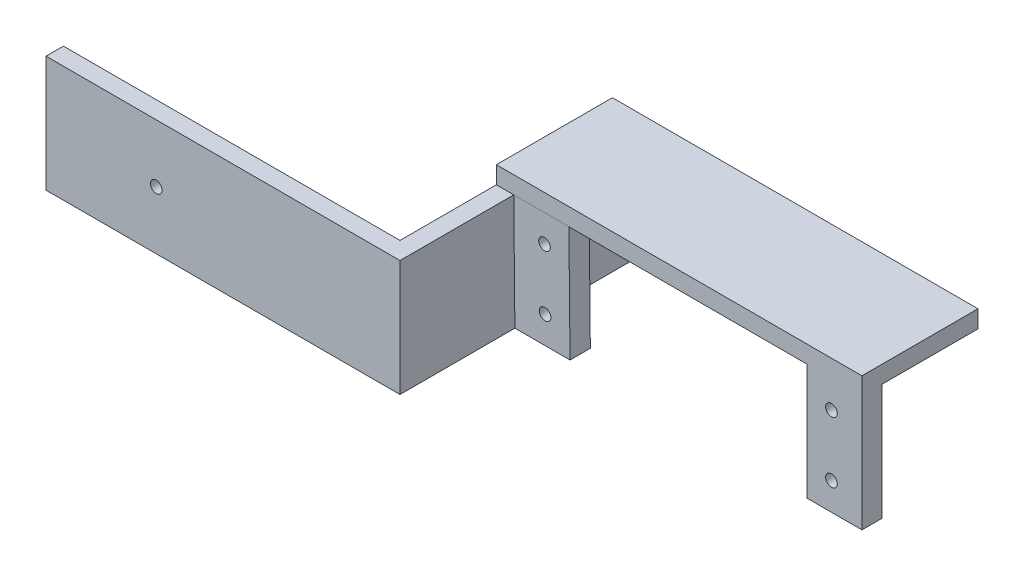
ISO-10303-21;
HEADER;
FILE_DESCRIPTION(('STEP AP214'),'2;1');
FILE_NAME('part.step','',(''),(''),'','','');
FILE_SCHEMA(('AUTOMOTIVE_DESIGN { 1 0 10303 214 1 1 1 1 }'));
ENDSEC;
DATA;
#1=APPLICATION_CONTEXT('core data for automotive mechanical design processes');
#2=APPLICATION_PROTOCOL_DEFINITION('international standard','automotive_design',2000,#1);
#3=PRODUCT_CONTEXT('',#1,'mechanical');
#4=PRODUCT('Part','Part','',(#3));
#5=PRODUCT_RELATED_PRODUCT_CATEGORY('part','',(#4));
#6=PRODUCT_DEFINITION_FORMATION('','',#4);
#7=PRODUCT_DEFINITION_CONTEXT('part definition',#1,'design');
#8=PRODUCT_DEFINITION('design','',#6,#7);
#9=PRODUCT_DEFINITION_SHAPE('','',#8);
#10=(LENGTH_UNIT() NAMED_UNIT(*) SI_UNIT(.MILLI.,.METRE.));
#11=(NAMED_UNIT(*) PLANE_ANGLE_UNIT() SI_UNIT($,.RADIAN.));
#12=(NAMED_UNIT(*) SI_UNIT($,.STERADIAN.) SOLID_ANGLE_UNIT());
#13=UNCERTAINTY_MEASURE_WITH_UNIT(LENGTH_MEASURE(1.E-05),#10,'distance_accuracy_value','');
#14=(GEOMETRIC_REPRESENTATION_CONTEXT(3) GLOBAL_UNCERTAINTY_ASSIGNED_CONTEXT((#13)) GLOBAL_UNIT_ASSIGNED_CONTEXT((#10,
#11,#12)) REPRESENTATION_CONTEXT('',''));
#15=CARTESIAN_POINT('',(0.,0.,0.));
#16=DIRECTION('',(0.,0.,1.));
#17=DIRECTION('',(1.,0.,0.));
#18=AXIS2_PLACEMENT_3D('',#15,#16,#17);
#19=CARTESIAN_POINT('',(57.4713641488162,20.,9.21573145148629));
#20=DIRECTION('',(0.,1.,0.));
#21=DIRECTION('',(0.,0.,1.));
#22=AXIS2_PLACEMENT_3D('',#19,#20,#21);
#23=PLANE('',#22);
#24=DIRECTION('',(0.,0.,-1.));
#25=VECTOR('',#24,1.);
#26=CARTESIAN_POINT('',(47.9713641488162,20.,5.71573145148629));
#27=LINE('',#26,#25);
#28=CARTESIAN_POINT('',(47.9713641488162,20.,9.21573145148629));
#29=VERTEX_POINT('',#28);
#30=CARTESIAN_POINT('',(47.9713641488162,20.,5.71573145148629));
#31=VERTEX_POINT('',#30);
#32=EDGE_CURVE('E303',#29,#31,#27,.T.);
#33=ORIENTED_EDGE('',*,*,#32,.F.);
#34=DIRECTION('',(-1.,0.,0.));
#35=VECTOR('',#34,1.);
#36=CARTESIAN_POINT('',(57.4713641488162,20.,9.21573145148629));
#37=LINE('',#36,#35);
#38=CARTESIAN_POINT('',(6.97136414881624,20.,9.21573145148629));
#39=VERTEX_POINT('',#38);
#40=EDGE_CURVE('E174',#29,#39,#37,.T.);
#41=ORIENTED_EDGE('',*,*,#40,.T.);
#42=DIRECTION('',(0.,0.,1.));
#43=VECTOR('',#42,1.);
#44=CARTESIAN_POINT('',(6.97136414881624,20.,5.71573145148628));
#45=LINE('',#44,#43);
#46=CARTESIAN_POINT('',(6.97136414881624,20.,5.71573145148628));
#47=VERTEX_POINT('',#46);
#48=EDGE_CURVE('E182',#47,#39,#45,.T.);
#49=ORIENTED_EDGE('',*,*,#48,.F.);
#50=DIRECTION('',(-1.,0.,0.));
#51=VECTOR('',#50,1.);
#52=CARTESIAN_POINT('',(6.97136414881624,20.,5.71573145148628));
#53=LINE('',#52,#51);
#54=CARTESIAN_POINT('',(-2.52863585118376,20.,5.71573145148628));
#55=VERTEX_POINT('',#54);
#56=EDGE_CURVE('E58',#47,#55,#53,.T.);
#57=ORIENTED_EDGE('',*,*,#56,.T.);
#58=DIRECTION('',(0.,0.,-1.));
#59=VECTOR('',#58,1.);
#60=CARTESIAN_POINT('',(-2.52863585118376,20.,9.21573145148629));
#61=LINE('',#60,#59);
#62=CARTESIAN_POINT('',(-2.52863585118376,20.,-10.7842685485137));
#63=VERTEX_POINT('',#62);
#64=EDGE_CURVE('E200',#55,#63,#61,.T.);
#65=ORIENTED_EDGE('',*,*,#64,.T.);
#66=DIRECTION('',(-1.,0.,0.));
#67=VECTOR('',#66,1.);
#68=CARTESIAN_POINT('',(57.4713641488162,20.,-10.7842685485137));
#69=LINE('',#68,#67);
#70=CARTESIAN_POINT('',(57.4713641488162,20.,-10.7842685485137));
#71=VERTEX_POINT('',#70);
#72=EDGE_CURVE('E211',#71,#63,#69,.T.);
#73=ORIENTED_EDGE('',*,*,#72,.F.);
#74=DIRECTION('',(0.,0.,-1.));
#75=VECTOR('',#74,1.);
#76=CARTESIAN_POINT('',(57.4713641488162,20.,9.21573145148629));
#77=LINE('',#76,#75);
#78=CARTESIAN_POINT('',(57.4713641488162,20.,5.71573145148629));
#79=VERTEX_POINT('',#78);
#80=EDGE_CURVE('E203',#79,#71,#77,.T.);
#81=ORIENTED_EDGE('',*,*,#80,.F.);
#82=DIRECTION('',(1.,0.,0.));
#83=VECTOR('',#82,1.);
#84=CARTESIAN_POINT('',(57.4713641488162,20.,5.71573145148629));
#85=LINE('',#84,#83);
#86=EDGE_CURVE('E168',#31,#79,#85,.T.);
#87=ORIENTED_EDGE('',*,*,#86,.F.);
#88=EDGE_LOOP('',(#33,#41,#49,#57,#65,#73,#81,#87));
#89=FACE_BOUND('',#88,.T.);
#90=ADVANCED_FACE('F33',(#89),#23,.F.);
#91=CARTESIAN_POINT('',(-2.52863585118376,20.,28.8157314514863));
#92=DIRECTION('',(-1.,0.,0.));
#93=DIRECTION('',(0.,0.,1.));
#94=AXIS2_PLACEMENT_3D('',#91,#92,#93);
#95=PLANE('',#94);
#96=DIRECTION('',(0.,-0.999950003749688,-0.00999950003749664));
#97=VECTOR('',#96,1.);
#98=CARTESIAN_POINT('',(-2.52863585118376,20.,9.21573145148629));
#99=LINE('',#98,#97);
#100=CARTESIAN_POINT('',(-2.52863585118376,20.,9.21573145148629));
#101=VERTEX_POINT('',#100);
#102=CARTESIAN_POINT('',(-2.52863585118376,0.,9.0157314514863));
#103=VERTEX_POINT('',#102);
#104=EDGE_CURVE('E175',#101,#103,#99,.T.);
#105=ORIENTED_EDGE('',*,*,#104,.F.);
#106=DIRECTION('',(0.,0.,-1.));
#107=VECTOR('',#106,1.);
#108=CARTESIAN_POINT('',(-2.52863585118376,20.,28.8157314514863));
#109=LINE('',#108,#107);
#110=CARTESIAN_POINT('',(-2.52863585118376,20.,28.8157314514863));
#111=VERTEX_POINT('',#110);
#112=EDGE_CURVE('E235',#111,#101,#109,.T.);
#113=ORIENTED_EDGE('',*,*,#112,.F.);
#114=DIRECTION('',(0.,-1.,0.));
#115=VECTOR('',#114,1.);
#116=CARTESIAN_POINT('',(-2.52863585118376,20.,28.8157314514863));
#117=LINE('',#116,#115);
#118=CARTESIAN_POINT('',(-2.52863585118376,0.,28.8157314514863));
#119=VERTEX_POINT('',#118);
#120=EDGE_CURVE('E42',#111,#119,#117,.T.);
#121=ORIENTED_EDGE('',*,*,#120,.T.);
#122=DIRECTION('',(0.,0.,-1.));
#123=VECTOR('',#122,1.);
#124=CARTESIAN_POINT('',(-2.52863585118376,0.,28.8157314514863));
#125=LINE('',#124,#123);
#126=EDGE_CURVE('E248',#119,#103,#125,.T.);
#127=ORIENTED_EDGE('',*,*,#126,.T.);
#128=EDGE_LOOP('',(#105,#113,#121,#127));
#129=FACE_BOUND('',#128,.T.);
#130=ADVANCED_FACE('F336',(#129),#95,.F.);
#131=DIRECTION('',(0.,0.999950003749688,0.00999950003749664));
#132=VECTOR('',#131,1.);
#133=CARTESIAN_POINT('',(-2.52863585118376,0.,5.51573145148629));
#134=LINE('',#133,#132);
#135=CARTESIAN_POINT('',(-2.52863585118376,0.,5.51573145148629));
#136=VERTEX_POINT('',#135);
#137=EDGE_CURVE('E177',#136,#55,#134,.T.);
#138=ORIENTED_EDGE('',*,*,#137,.F.);
#139=CARTESIAN_POINT('',(-2.52863585118376,0.,-10.7842685485137));
#140=VERTEX_POINT('',#139);
#141=EDGE_CURVE('E247',#136,#140,#125,.T.);
#142=ORIENTED_EDGE('',*,*,#141,.T.);
#143=DIRECTION('',(0.,-1.,0.));
#144=VECTOR('',#143,1.);
#145=CARTESIAN_POINT('',(-2.52863585118376,20.,-10.7842685485137));
#146=LINE('',#145,#144);
#147=EDGE_CURVE('E264',#63,#140,#146,.T.);
#148=ORIENTED_EDGE('',*,*,#147,.F.);
#149=ORIENTED_EDGE('',*,*,#64,.F.);
#150=EDGE_LOOP('',(#138,#142,#148,#149));
#151=FACE_BOUND('',#150,.T.);
#152=ADVANCED_FACE('F355',(#151),#95,.F.);
#153=CARTESIAN_POINT('',(0.,20.,0.));
#154=DIRECTION('',(0.,-1.,0.));
#155=DIRECTION('',(0.,0.,-1.));
#156=AXIS2_PLACEMENT_3D('',#153,#154,#155);
#157=PLANE('',#156);
#158=DIRECTION('',(1.,0.,0.));
#159=VECTOR('',#158,1.);
#160=CARTESIAN_POINT('',(-5.52863585118376,20.,9.21573145148629));
#161=LINE('',#160,#159);
#162=CARTESIAN_POINT('',(-5.52863585118376,20.,9.21573145148629));
#163=VERTEX_POINT('',#162);
#164=EDGE_CURVE('E216',#163,#101,#161,.T.);
#165=ORIENTED_EDGE('',*,*,#164,.F.);
#166=DIRECTION('',(0.,0.,1.));
#167=VECTOR('',#166,1.);
#168=CARTESIAN_POINT('',(-5.52863585118376,20.,-10.7842685485137));
#169=LINE('',#168,#167);
#170=CARTESIAN_POINT('',(-5.52863585118376,20.,25.8157314514863));
#171=VERTEX_POINT('',#170);
#172=EDGE_CURVE('E238',#163,#171,#169,.T.);
#173=ORIENTED_EDGE('',*,*,#172,.T.);
#174=DIRECTION('',(-1.,0.,0.));
#175=VECTOR('',#174,1.);
#176=CARTESIAN_POINT('',(-63.5286358511838,20.,25.8157314514863));
#177=LINE('',#176,#175);
#178=CARTESIAN_POINT('',(-63.5286358511838,20.,25.8157314514863));
#179=VERTEX_POINT('',#178);
#180=EDGE_CURVE('E240',#171,#179,#177,.T.);
#181=ORIENTED_EDGE('',*,*,#180,.T.);
#182=DIRECTION('',(0.,0.,1.));
#183=VECTOR('',#182,1.);
#184=CARTESIAN_POINT('',(-63.5286358511838,20.,28.8157314514863));
#185=LINE('',#184,#183);
#186=CARTESIAN_POINT('',(-63.5286358511838,20.,28.8157314514863));
#187=VERTEX_POINT('',#186);
#188=EDGE_CURVE('E229',#179,#187,#185,.T.);
#189=ORIENTED_EDGE('',*,*,#188,.T.);
#190=DIRECTION('',(1.,0.,0.));
#191=VECTOR('',#190,1.);
#192=CARTESIAN_POINT('',(-63.5286358511838,20.,28.8157314514863));
#193=LINE('',#192,#191);
#194=EDGE_CURVE('E232',#187,#111,#193,.T.);
#195=ORIENTED_EDGE('',*,*,#194,.T.);
#196=ORIENTED_EDGE('',*,*,#112,.T.);
#197=EDGE_LOOP('',(#165,#173,#181,#189,#195,#196));
#198=FACE_BOUND('',#197,.T.);
#199=ADVANCED_FACE('F330',(#198),#157,.F.);
#200=CARTESIAN_POINT('',(-63.5286358511838,20.,28.8157314514863));
#201=DIRECTION('',(1.,0.,0.));
#202=DIRECTION('',(0.,0.,-1.));
#203=AXIS2_PLACEMENT_3D('',#200,#201,#202);
#204=PLANE('',#203);
#205=DIRECTION('',(0.,0.,1.));
#206=VECTOR('',#205,1.);
#207=CARTESIAN_POINT('',(-63.5286358511838,0.,28.8157314514863));
#208=LINE('',#207,#206);
#209=CARTESIAN_POINT('',(-63.5286358511838,0.,25.8157314514863));
#210=VERTEX_POINT('',#209);
#211=CARTESIAN_POINT('',(-63.5286358511838,0.,28.8157314514863));
#212=VERTEX_POINT('',#211);
#213=EDGE_CURVE('E228',#210,#212,#208,.T.);
#214=ORIENTED_EDGE('',*,*,#213,.T.);
#215=DIRECTION('',(0.,-1.,0.));
#216=VECTOR('',#215,1.);
#217=CARTESIAN_POINT('',(-63.5286358511838,20.,28.8157314514863));
#218=LINE('',#217,#216);
#219=EDGE_CURVE('E11',#187,#212,#218,.T.);
#220=ORIENTED_EDGE('',*,*,#219,.F.);
#221=ORIENTED_EDGE('',*,*,#188,.F.);
#222=DIRECTION('',(0.,-1.,0.));
#223=VECTOR('',#222,1.);
#224=CARTESIAN_POINT('',(-63.5286358511838,20.,25.8157314514863));
#225=LINE('',#224,#223);
#226=EDGE_CURVE('E242',#179,#210,#225,.T.);
#227=ORIENTED_EDGE('',*,*,#226,.T.);
#228=EDGE_LOOP('',(#214,#220,#221,#227));
#229=FACE_BOUND('',#228,.T.);
#230=ADVANCED_FACE('F35',(#229),#204,.F.);
#231=CARTESIAN_POINT('',(-63.5286358511838,20.,28.8157314514863));
#232=DIRECTION('',(0.,0.,-1.));
#233=DIRECTION('',(-1.,0.,0.));
#234=AXIS2_PLACEMENT_3D('',#231,#232,#233);
#235=PLANE('',#234);
#236=CARTESIAN_POINT('',(-44.5286358511838,10.,28.8157314514863));
#237=DIRECTION('',(0.,0.,-1.));
#238=DIRECTION('',(-1.,0.,0.));
#239=AXIS2_PLACEMENT_3D('',#236,#237,#238);
#240=CIRCLE('',#239,0.999999999999998);
#241=CARTESIAN_POINT('',(-45.5286358511838,10.,28.8157314514863));
#242=VERTEX_POINT('',#241);
#243=EDGE_CURVE('E294',#242,#242,#240,.T.);
#244=ORIENTED_EDGE('',*,*,#243,.T.);
#245=EDGE_LOOP('',(#244));
#246=FACE_BOUND('',#245,.T.);
#247=DIRECTION('',(1.,0.,0.));
#248=VECTOR('',#247,1.);
#249=CARTESIAN_POINT('',(-63.5286358511838,0.,28.8157314514863));
#250=LINE('',#249,#248);
#251=EDGE_CURVE('E245',#212,#119,#250,.T.);
#252=ORIENTED_EDGE('',*,*,#251,.T.);
#253=ORIENTED_EDGE('',*,*,#120,.F.);
#254=ORIENTED_EDGE('',*,*,#194,.F.);
#255=ORIENTED_EDGE('',*,*,#219,.T.);
#256=EDGE_LOOP('',(#252,#253,#254,#255));
#257=FACE_BOUND('',#256,.T.);
#258=ADVANCED_FACE('F359',(#246,#257),#235,.F.);
#259=CARTESIAN_POINT('',(-2.52863585118376,20.,-10.7842685485137));
#260=DIRECTION('',(0.,0.,1.));
#261=DIRECTION('',(1.,0.,0.));
#262=AXIS2_PLACEMENT_3D('',#259,#260,#261);
#263=PLANE('',#262);
#264=DIRECTION('',(-1.,0.,0.));
#265=VECTOR('',#264,1.);
#266=CARTESIAN_POINT('',(-2.52863585118376,0.,-10.7842685485137));
#267=LINE('',#266,#265);
#268=CARTESIAN_POINT('',(-5.52863585118376,0.,-10.7842685485137));
#269=VERTEX_POINT('',#268);
#270=EDGE_CURVE('E251',#140,#269,#267,.T.);
#271=ORIENTED_EDGE('',*,*,#270,.T.);
#272=DIRECTION('',(0.,-1.,0.));
#273=VECTOR('',#272,1.);
#274=CARTESIAN_POINT('',(-5.52863585118376,20.,-10.7842685485137));
#275=LINE('',#274,#273);
#276=CARTESIAN_POINT('',(-5.52863585118376,23.,-10.7842685485137));
#277=VERTEX_POINT('',#276);
#278=EDGE_CURVE('E261',#277,#269,#275,.T.);
#279=ORIENTED_EDGE('',*,*,#278,.F.);
#280=DIRECTION('',(-1.,0.,0.));
#281=VECTOR('',#280,1.);
#282=CARTESIAN_POINT('',(-2.52863585118376,23.,-10.7842685485137));
#283=LINE('',#282,#281);
#284=CARTESIAN_POINT('',(57.4713641488162,23.,-10.7842685485137));
#285=VERTEX_POINT('',#284);
#286=EDGE_CURVE('E217',#285,#277,#283,.T.);
#287=ORIENTED_EDGE('',*,*,#286,.F.);
#288=DIRECTION('',(0.,1.,0.));
#289=VECTOR('',#288,1.);
#290=CARTESIAN_POINT('',(57.4713641488162,20.,-10.7842685485137));
#291=LINE('',#290,#289);
#292=EDGE_CURVE('E205',#71,#285,#291,.T.);
#293=ORIENTED_EDGE('',*,*,#292,.F.);
#294=ORIENTED_EDGE('',*,*,#72,.T.);
#295=ORIENTED_EDGE('',*,*,#147,.T.);
#296=EDGE_LOOP('',(#271,#279,#287,#293,#294,#295));
#297=FACE_BOUND('',#296,.T.);
#298=ADVANCED_FACE('F357',(#297),#263,.F.);
#299=CARTESIAN_POINT('',(-5.52863585118376,20.,-10.7842685485137));
#300=DIRECTION('',(1.,0.,0.));
#301=DIRECTION('',(0.,0.,-1.));
#302=AXIS2_PLACEMENT_3D('',#299,#300,#301);
#303=PLANE('',#302);
#304=DIRECTION('',(0.,0.,1.));
#305=VECTOR('',#304,1.);
#306=CARTESIAN_POINT('',(-5.52863585118376,0.,-10.7842685485137));
#307=LINE('',#306,#305);
#308=CARTESIAN_POINT('',(-5.52863585118376,0.,25.8157314514863));
#309=VERTEX_POINT('',#308);
#310=EDGE_CURVE('E253',#269,#309,#307,.T.);
#311=ORIENTED_EDGE('',*,*,#310,.T.);
#312=DIRECTION('',(0.,-1.,0.));
#313=VECTOR('',#312,1.);
#314=CARTESIAN_POINT('',(-5.52863585118376,20.,25.8157314514863));
#315=LINE('',#314,#313);
#316=EDGE_CURVE('E258',#171,#309,#315,.T.);
#317=ORIENTED_EDGE('',*,*,#316,.F.);
#318=ORIENTED_EDGE('',*,*,#172,.F.);
#319=DIRECTION('',(0.,-1.,0.));
#320=VECTOR('',#319,1.);
#321=CARTESIAN_POINT('',(-5.52863585118376,23.,9.21573145148629));
#322=LINE('',#321,#320);
#323=CARTESIAN_POINT('',(-5.52863585118376,23.,9.21573145148629));
#324=VERTEX_POINT('',#323);
#325=EDGE_CURVE('E224',#324,#163,#322,.T.);
#326=ORIENTED_EDGE('',*,*,#325,.F.);
#327=DIRECTION('',(0.,0.,1.));
#328=VECTOR('',#327,1.);
#329=CARTESIAN_POINT('',(-5.52863585118376,23.,-10.7842685485137));
#330=LINE('',#329,#328);
#331=EDGE_CURVE('E220',#277,#324,#330,.T.);
#332=ORIENTED_EDGE('',*,*,#331,.F.);
#333=ORIENTED_EDGE('',*,*,#278,.T.);
#334=EDGE_LOOP('',(#311,#317,#318,#326,#332,#333));
#335=FACE_BOUND('',#334,.T.);
#336=ADVANCED_FACE('F326',(#335),#303,.F.);
#337=CARTESIAN_POINT('',(-63.5286358511838,20.,25.8157314514863));
#338=DIRECTION('',(0.,0.,1.));
#339=DIRECTION('',(1.,0.,0.));
#340=AXIS2_PLACEMENT_3D('',#337,#338,#339);
#341=PLANE('',#340);
#342=CARTESIAN_POINT('',(-44.5286358511838,10.,25.8157314514863));
#343=DIRECTION('',(0.,0.,-1.));
#344=DIRECTION('',(-1.,0.,0.));
#345=AXIS2_PLACEMENT_3D('',#342,#343,#344);
#346=CIRCLE('',#345,4.00000000000001);
#347=CARTESIAN_POINT('',(-48.5286358511838,10.,25.8157314514863));
#348=VERTEX_POINT('',#347);
#349=EDGE_CURVE('E297',#348,#348,#346,.T.);
#350=ORIENTED_EDGE('',*,*,#349,.F.);
#351=EDGE_LOOP('',(#350));
#352=FACE_BOUND('',#351,.T.);
#353=DIRECTION('',(-1.,0.,0.));
#354=VECTOR('',#353,1.);
#355=CARTESIAN_POINT('',(-63.5286358511838,0.,25.8157314514863));
#356=LINE('',#355,#354);
#357=EDGE_CURVE('E233',#309,#210,#356,.T.);
#358=ORIENTED_EDGE('',*,*,#357,.T.);
#359=ORIENTED_EDGE('',*,*,#226,.F.);
#360=ORIENTED_EDGE('',*,*,#180,.F.);
#361=ORIENTED_EDGE('',*,*,#316,.T.);
#362=EDGE_LOOP('',(#358,#359,#360,#361));
#363=FACE_BOUND('',#362,.T.);
#364=ADVANCED_FACE('F365',(#352,#363),#341,.F.);
#365=CARTESIAN_POINT('',(0.,0.,0.));
#366=DIRECTION('',(0.,-1.,0.));
#367=DIRECTION('',(0.,0.,-1.));
#368=AXIS2_PLACEMENT_3D('',#365,#366,#367);
#369=PLANE('',#368);
#370=ORIENTED_EDGE('',*,*,#213,.F.);
#371=ORIENTED_EDGE('',*,*,#357,.F.);
#372=ORIENTED_EDGE('',*,*,#310,.F.);
#373=ORIENTED_EDGE('',*,*,#270,.F.);
#374=ORIENTED_EDGE('',*,*,#141,.F.);
#375=DIRECTION('',(-1.,0.,0.));
#376=VECTOR('',#375,1.);
#377=CARTESIAN_POINT('',(6.97136414881624,0.,5.51573145148629));
#378=LINE('',#377,#376);
#379=CARTESIAN_POINT('',(6.97136414881624,0.,5.51573145148629));
#380=VERTEX_POINT('',#379);
#381=EDGE_CURVE('E193',#380,#136,#378,.T.);
#382=ORIENTED_EDGE('',*,*,#381,.F.);
#383=DIRECTION('',(0.,0.,-1.));
#384=VECTOR('',#383,1.);
#385=CARTESIAN_POINT('',(6.97136414881624,0.,9.0157314514863));
#386=LINE('',#385,#384);
#387=CARTESIAN_POINT('',(6.97136414881624,0.,9.0157314514863));
#388=VERTEX_POINT('',#387);
#389=EDGE_CURVE('E187',#388,#380,#386,.T.);
#390=ORIENTED_EDGE('',*,*,#389,.F.);
#391=DIRECTION('',(-1.,0.,0.));
#392=VECTOR('',#391,1.);
#393=CARTESIAN_POINT('',(6.97136414881624,0.,9.0157314514863));
#394=LINE('',#393,#392);
#395=EDGE_CURVE('E195',#388,#103,#394,.T.);
#396=ORIENTED_EDGE('',*,*,#395,.T.);
#397=ORIENTED_EDGE('',*,*,#126,.F.);
#398=ORIENTED_EDGE('',*,*,#251,.F.);
#399=EDGE_LOOP('',(#370,#371,#372,#373,#374,#382,#390,#396,#397,#398));
#400=FACE_BOUND('',#399,.T.);
#401=ADVANCED_FACE('F345',(#400),#369,.T.);
#402=CARTESIAN_POINT('',(-5.52863585118376,23.,9.21573145148629));
#403=DIRECTION('',(0.,0.,-1.));
#404=DIRECTION('',(-1.,0.,0.));
#405=AXIS2_PLACEMENT_3D('',#402,#403,#404);
#406=PLANE('',#405);
#407=CARTESIAN_POINT('',(52.2213641488162,4.7482374940628,9.21573145148635));
#408=DIRECTION('',(0.,0.,-1.));
#409=DIRECTION('',(1.1564823173179E-13,-1.,0.));
#410=AXIS2_PLACEMENT_3D('',#407,#408,#409);
#411=ELLIPSE('',#410,1.00004999875006,0.999999999999998);
#412=CARTESIAN_POINT('',(52.2213641488164,3.74818749531274,9.21573145148635));
#413=VERTEX_POINT('',#412);
#414=EDGE_CURVE('E276',#413,#413,#411,.T.);
#415=ORIENTED_EDGE('',*,*,#414,.T.);
#416=EDGE_LOOP('',(#415));
#417=FACE_BOUND('',#416,.T.);
#418=CARTESIAN_POINT('',(52.2213641488162,15.2492624934378,9.21573145148635));
#419=DIRECTION('',(0.,0.,-1.));
#420=DIRECTION('',(1.1564823173179E-13,-1.,0.));
#421=AXIS2_PLACEMENT_3D('',#418,#419,#420);
#422=ELLIPSE('',#421,1.00004999875006,0.999999999999999);
#423=CARTESIAN_POINT('',(52.2213641488164,14.2492124946878,9.21573145148635));
#424=VERTEX_POINT('',#423);
#425=EDGE_CURVE('E272',#424,#424,#422,.T.);
#426=ORIENTED_EDGE('',*,*,#425,.T.);
#427=EDGE_LOOP('',(#426));
#428=FACE_BOUND('',#427,.T.);
#429=ORIENTED_EDGE('',*,*,#164,.T.);
#430=DIRECTION('',(-1.,0.,0.));
#431=VECTOR('',#430,1.);
#432=CARTESIAN_POINT('',(6.97136414881624,20.,9.21573145148629));
#433=LINE('',#432,#431);
#434=EDGE_CURVE('E198',#39,#101,#433,.T.);
#435=ORIENTED_EDGE('',*,*,#434,.F.);
#436=ORIENTED_EDGE('',*,*,#40,.F.);
#437=DIRECTION('',(0.,1.,0.));
#438=VECTOR('',#437,1.);
#439=CARTESIAN_POINT('',(47.9713641488162,0.,9.21573145148629));
#440=LINE('',#439,#438);
#441=CARTESIAN_POINT('',(47.9713641488162,0.,9.21573145148629));
#442=VERTEX_POINT('',#441);
#443=EDGE_CURVE('E153',#442,#29,#440,.T.);
#444=ORIENTED_EDGE('',*,*,#443,.F.);
#445=DIRECTION('',(-1.,0.,0.));
#446=VECTOR('',#445,1.);
#447=CARTESIAN_POINT('',(47.9713641488162,0.,9.21573145148629));
#448=LINE('',#447,#446);
#449=CARTESIAN_POINT('',(57.4713641488162,0.,9.21573145148629));
#450=VERTEX_POINT('',#449);
#451=EDGE_CURVE('E160',#450,#442,#448,.T.);
#452=ORIENTED_EDGE('',*,*,#451,.F.);
#453=DIRECTION('',(0.,-1.,0.));
#454=VECTOR('',#453,1.);
#455=CARTESIAN_POINT('',(57.4713641488162,23.,9.21573145148629));
#456=LINE('',#455,#454);
#457=CARTESIAN_POINT('',(57.4713641488162,23.,9.21573145148629));
#458=VERTEX_POINT('',#457);
#459=EDGE_CURVE('E201',#458,#450,#456,.T.);
#460=ORIENTED_EDGE('',*,*,#459,.F.);
#461=DIRECTION('',(1.,0.,0.));
#462=VECTOR('',#461,1.);
#463=CARTESIAN_POINT('',(-5.52863585118376,23.,9.21573145148629));
#464=LINE('',#463,#462);
#465=EDGE_CURVE('E222',#324,#458,#464,.T.);
#466=ORIENTED_EDGE('',*,*,#465,.F.);
#467=ORIENTED_EDGE('',*,*,#325,.T.);
#468=EDGE_LOOP('',(#429,#435,#436,#444,#452,#460,#466,#467));
#469=FACE_BOUND('',#468,.T.);
#470=ADVANCED_FACE('F172',(#417,#428,#469),#406,.F.);
#471=CARTESIAN_POINT('',(0.,23.,0.));
#472=DIRECTION('',(0.,1.,0.));
#473=DIRECTION('',(0.,0.,1.));
#474=AXIS2_PLACEMENT_3D('',#471,#472,#473);
#475=PLANE('',#474);
#476=ORIENTED_EDGE('',*,*,#465,.T.);
#477=DIRECTION('',(0.,0.,1.));
#478=VECTOR('',#477,1.);
#479=CARTESIAN_POINT('',(57.4713641488162,23.,-10.7842685485137));
#480=LINE('',#479,#478);
#481=EDGE_CURVE('E208',#285,#458,#480,.T.);
#482=ORIENTED_EDGE('',*,*,#481,.F.);
#483=ORIENTED_EDGE('',*,*,#286,.T.);
#484=ORIENTED_EDGE('',*,*,#331,.T.);
#485=EDGE_LOOP('',(#476,#482,#483,#484));
#486=FACE_BOUND('',#485,.T.);
#487=ADVANCED_FACE('F320',(#486),#475,.T.);
#488=CARTESIAN_POINT('',(57.4713641488162,0.,0.));
#489=DIRECTION('',(1.,0.,0.));
#490=DIRECTION('',(0.,0.,-1.));
#491=AXIS2_PLACEMENT_3D('',#488,#489,#490);
#492=PLANE('',#491);
#493=ORIENTED_EDGE('',*,*,#459,.T.);
#494=DIRECTION('',(0.,0.,1.));
#495=VECTOR('',#494,1.);
#496=CARTESIAN_POINT('',(57.4713641488162,0.,9.21573145148629));
#497=LINE('',#496,#495);
#498=CARTESIAN_POINT('',(57.4713641488162,0.,5.71573145148629));
#499=VERTEX_POINT('',#498);
#500=EDGE_CURVE('E165',#499,#450,#497,.T.);
#501=ORIENTED_EDGE('',*,*,#500,.F.);
#502=DIRECTION('',(0.,1.,0.));
#503=VECTOR('',#502,1.);
#504=CARTESIAN_POINT('',(57.4713641488162,0.,5.71573145148629));
#505=LINE('',#504,#503);
#506=EDGE_CURVE('E50',#499,#79,#505,.T.);
#507=ORIENTED_EDGE('',*,*,#506,.T.);
#508=ORIENTED_EDGE('',*,*,#80,.T.);
#509=ORIENTED_EDGE('',*,*,#292,.T.);
#510=ORIENTED_EDGE('',*,*,#481,.T.);
#511=EDGE_LOOP('',(#493,#501,#507,#508,#509,#510));
#512=FACE_BOUND('',#511,.T.);
#513=ADVANCED_FACE('F316',(#512),#492,.T.);
#514=CARTESIAN_POINT('',(6.97136414881624,20.,9.21573145148629));
#515=DIRECTION('',(0.,0.00999950003749664,-0.999950003749688));
#516=DIRECTION('',(0.,0.999950003749688,0.00999950003749664));
#517=AXIS2_PLACEMENT_3D('',#514,#515,#516);
#518=PLANE('',#517);
#519=CARTESIAN_POINT('',(2.72136414881623,15.2497375196859,9.16822882668315));
#520=DIRECTION('',(0.,0.00999950003749664,-0.999950003749688));
#521=DIRECTION('',(0.,0.999950003749688,0.00999950003749664));
#522=AXIS2_PLACEMENT_3D('',#519,#520,#521);
#523=CIRCLE('',#522,1.);
#524=CARTESIAN_POINT('',(2.72136414881623,16.2496875234355,9.17822832672065));
#525=VERTEX_POINT('',#524);
#526=EDGE_CURVE('E273',#525,#525,#523,.T.);
#527=ORIENTED_EDGE('',*,*,#526,.T.);
#528=EDGE_LOOP('',(#527));
#529=FACE_BOUND('',#528,.T.);
#530=CARTESIAN_POINT('',(2.72136414881623,4.74976251781102,9.0632290766644));
#531=DIRECTION('',(0.,0.00999950003749664,-0.999950003749688));
#532=DIRECTION('',(0.,0.999950003749688,0.00999950003749664));
#533=AXIS2_PLACEMENT_3D('',#530,#531,#532);
#534=CIRCLE('',#533,1.);
#535=CARTESIAN_POINT('',(2.72136414881623,5.7497125215607,9.0732285767019));
#536=VERTEX_POINT('',#535);
#537=EDGE_CURVE('E279',#536,#536,#534,.T.);
#538=ORIENTED_EDGE('',*,*,#537,.T.);
#539=EDGE_LOOP('',(#538));
#540=FACE_BOUND('',#539,.T.);
#541=ORIENTED_EDGE('',*,*,#104,.T.);
#542=ORIENTED_EDGE('',*,*,#395,.F.);
#543=DIRECTION('',(0.,-0.999950003749688,-0.00999950003749664));
#544=VECTOR('',#543,1.);
#545=CARTESIAN_POINT('',(6.97136414881624,20.,9.21573145148629));
#546=LINE('',#545,#544);
#547=EDGE_CURVE('E185',#39,#388,#546,.T.);
#548=ORIENTED_EDGE('',*,*,#547,.F.);
#549=ORIENTED_EDGE('',*,*,#434,.T.);
#550=EDGE_LOOP('',(#541,#542,#548,#549));
#551=FACE_BOUND('',#550,.T.);
#552=ADVANCED_FACE('F340',(#529,#540,#551),#518,.F.);
#553=CARTESIAN_POINT('',(6.97136414881624,0.,5.51573145148629));
#554=DIRECTION('',(0.,-0.00999950003749664,0.999950003749688));
#555=DIRECTION('',(0.,-0.999950003749688,-0.00999950003749664));
#556=AXIS2_PLACEMENT_3D('',#553,#554,#555);
#557=PLANE('',#556);
#558=CARTESIAN_POINT('',(2.72136414881623,15.2847340200358,5.66857879168664));
#559=DIRECTION('',(0.,-0.00999950003749664,0.999950003749688));
#560=DIRECTION('',(0.,-0.999950003749688,-0.00999950003749664));
#561=AXIS2_PLACEMENT_3D('',#558,#559,#560);
#562=CIRCLE('',#561,1.);
#563=CARTESIAN_POINT('',(2.72136414881623,14.2847840162861,5.65857929164915));
#564=VERTEX_POINT('',#563);
#565=EDGE_CURVE('E37',#564,#564,#562,.T.);
#566=ORIENTED_EDGE('',*,*,#565,.T.);
#567=EDGE_LOOP('',(#566));
#568=FACE_BOUND('',#567,.T.);
#569=CARTESIAN_POINT('',(2.72136414881623,4.78475901816098,5.5635790416679));
#570=DIRECTION('',(0.,-0.00999950003749664,0.999950003749688));
#571=DIRECTION('',(0.,-0.999950003749688,-0.00999950003749664));
#572=AXIS2_PLACEMENT_3D('',#569,#570,#571);
#573=CIRCLE('',#572,1.);
#574=CARTESIAN_POINT('',(2.72136414881623,3.78480901441129,5.5535795416304));
#575=VERTEX_POINT('',#574);
#576=EDGE_CURVE('E277',#575,#575,#573,.T.);
#577=ORIENTED_EDGE('',*,*,#576,.T.);
#578=EDGE_LOOP('',(#577));
#579=FACE_BOUND('',#578,.T.);
#580=ORIENTED_EDGE('',*,*,#137,.T.);
#581=ORIENTED_EDGE('',*,*,#56,.F.);
#582=DIRECTION('',(0.,0.999950003749688,0.00999950003749664));
#583=VECTOR('',#582,1.);
#584=CARTESIAN_POINT('',(6.97136414881624,0.,5.51573145148629));
#585=LINE('',#584,#583);
#586=EDGE_CURVE('E189',#380,#47,#585,.T.);
#587=ORIENTED_EDGE('',*,*,#586,.F.);
#588=ORIENTED_EDGE('',*,*,#381,.T.);
#589=EDGE_LOOP('',(#580,#581,#587,#588));
#590=FACE_BOUND('',#589,.T.);
#591=ADVANCED_FACE('F455',(#568,#579,#590),#557,.F.);
#592=CARTESIAN_POINT('',(6.97136414881624,0.,0.));
#593=DIRECTION('',(1.,0.,0.));
#594=DIRECTION('',(0.,0.,-1.));
#595=AXIS2_PLACEMENT_3D('',#592,#593,#594);
#596=PLANE('',#595);
#597=ORIENTED_EDGE('',*,*,#48,.T.);
#598=ORIENTED_EDGE('',*,*,#547,.T.);
#599=ORIENTED_EDGE('',*,*,#389,.T.);
#600=ORIENTED_EDGE('',*,*,#586,.T.);
#601=EDGE_LOOP('',(#597,#598,#599,#600));
#602=FACE_BOUND('',#601,.T.);
#603=ADVANCED_FACE('F349',(#602),#596,.T.);
#604=CARTESIAN_POINT('',(47.9713641488162,0.,5.71573145148629));
#605=DIRECTION('',(1.,0.,0.));
#606=DIRECTION('',(0.,0.,-1.));
#607=AXIS2_PLACEMENT_3D('',#604,#605,#606);
#608=PLANE('',#607);
#609=ORIENTED_EDGE('',*,*,#32,.T.);
#610=DIRECTION('',(0.,1.,0.));
#611=VECTOR('',#610,1.);
#612=CARTESIAN_POINT('',(47.9713641488162,0.,5.71573145148629));
#613=LINE('',#612,#611);
#614=CARTESIAN_POINT('',(47.9713641488162,0.,5.71573145148629));
#615=VERTEX_POINT('',#614);
#616=EDGE_CURVE('E156',#615,#31,#613,.T.);
#617=ORIENTED_EDGE('',*,*,#616,.F.);
#618=DIRECTION('',(0.,0.,-1.));
#619=VECTOR('',#618,1.);
#620=CARTESIAN_POINT('',(47.9713641488162,0.,5.71573145148629));
#621=LINE('',#620,#619);
#622=EDGE_CURVE('E149',#442,#615,#621,.T.);
#623=ORIENTED_EDGE('',*,*,#622,.F.);
#624=ORIENTED_EDGE('',*,*,#443,.T.);
#625=EDGE_LOOP('',(#609,#617,#623,#624));
#626=FACE_BOUND('',#625,.T.);
#627=ADVANCED_FACE('F151',(#626),#608,.F.);
#628=CARTESIAN_POINT('',(57.4713641488162,0.,5.71573145148629));
#629=DIRECTION('',(0.,0.,1.));
#630=DIRECTION('',(1.,0.,0.));
#631=AXIS2_PLACEMENT_3D('',#628,#629,#630);
#632=PLANE('',#631);
#633=CARTESIAN_POINT('',(52.2213641488162,4.7832374940628,5.71573145148629));
#634=DIRECTION('',(0.,0.,1.));
#635=DIRECTION('',(0.,-1.,0.));
#636=AXIS2_PLACEMENT_3D('',#633,#634,#635);
#637=ELLIPSE('',#636,1.00004999875006,0.999999999999998);
#638=CARTESIAN_POINT('',(52.2213641488162,3.78318749531274,5.71573145148629));
#639=VERTEX_POINT('',#638);
#640=EDGE_CURVE('E274',#639,#639,#637,.T.);
#641=ORIENTED_EDGE('',*,*,#640,.T.);
#642=EDGE_LOOP('',(#641));
#643=FACE_BOUND('',#642,.T.);
#644=CARTESIAN_POINT('',(52.2213641488162,15.2842624934378,5.71573145148629));
#645=DIRECTION('',(0.,0.,1.));
#646=DIRECTION('',(0.,-1.,0.));
#647=AXIS2_PLACEMENT_3D('',#644,#645,#646);
#648=ELLIPSE('',#647,1.00004999875006,0.999999999999999);
#649=CARTESIAN_POINT('',(52.2213641488162,14.2842124946878,5.71573145148629));
#650=VERTEX_POINT('',#649);
#651=EDGE_CURVE('E269',#650,#650,#648,.T.);
#652=ORIENTED_EDGE('',*,*,#651,.T.);
#653=EDGE_LOOP('',(#652));
#654=FACE_BOUND('',#653,.T.);
#655=ORIENTED_EDGE('',*,*,#86,.T.);
#656=ORIENTED_EDGE('',*,*,#506,.F.);
#657=DIRECTION('',(1.,0.,0.));
#658=VECTOR('',#657,1.);
#659=CARTESIAN_POINT('',(57.4713641488162,0.,5.71573145148629));
#660=LINE('',#659,#658);
#661=EDGE_CURVE('E159',#615,#499,#660,.T.);
#662=ORIENTED_EDGE('',*,*,#661,.F.);
#663=ORIENTED_EDGE('',*,*,#616,.T.);
#664=EDGE_LOOP('',(#655,#656,#662,#663));
#665=FACE_BOUND('',#664,.T.);
#666=ADVANCED_FACE('F312',(#643,#654,#665),#632,.F.);
#667=CARTESIAN_POINT('',(0.,0.,0.));
#668=DIRECTION('',(0.,1.,0.));
#669=DIRECTION('',(0.,0.,1.));
#670=AXIS2_PLACEMENT_3D('',#667,#668,#669);
#671=PLANE('',#670);
#672=ORIENTED_EDGE('',*,*,#451,.T.);
#673=ORIENTED_EDGE('',*,*,#622,.T.);
#674=ORIENTED_EDGE('',*,*,#661,.T.);
#675=ORIENTED_EDGE('',*,*,#500,.T.);
#676=EDGE_LOOP('',(#672,#673,#674,#675));
#677=FACE_BOUND('',#676,.T.);
#678=ADVANCED_FACE('F164',(#677),#671,.F.);
#679=CARTESIAN_POINT('',(-44.5286358511838,10.,27.0157314514863));
#680=DIRECTION('',(0.,0.,-1.));
#681=DIRECTION('',(-1.,0.,0.));
#682=AXIS2_PLACEMENT_3D('',#679,#680,#681);
#683=CYLINDRICAL_SURFACE('',#682,4.00000000000001);
#684=CARTESIAN_POINT('',(-44.5286358511838,10.,27.0157314514863));
#685=DIRECTION('',(0.,0.,-1.));
#686=DIRECTION('',(-1.,0.,0.));
#687=AXIS2_PLACEMENT_3D('',#684,#685,#686);
#688=CIRCLE('',#687,4.00000000000001);
#689=CARTESIAN_POINT('',(-48.5286358511838,10.,27.0157314514863));
#690=VERTEX_POINT('',#689);
#691=EDGE_CURVE('E300',#690,#690,#688,.T.);
#692=ORIENTED_EDGE('',*,*,#691,.F.);
#693=EDGE_LOOP('',(#692));
#694=FACE_BOUND('',#693,.T.);
#695=ORIENTED_EDGE('',*,*,#349,.T.);
#696=EDGE_LOOP('',(#695));
#697=FACE_BOUND('',#696,.T.);
#698=ADVANCED_FACE('F415',(#694,#697),#683,.F.);
#699=CARTESIAN_POINT('',(-44.5286358511838,10.,27.0157314514863));
#700=DIRECTION('',(0.,0.,-1.));
#701=DIRECTION('',(-1.,0.,0.));
#702=AXIS2_PLACEMENT_3D('',#699,#700,#701);
#703=PLANE('',#702);
#704=CARTESIAN_POINT('',(-44.5286358511838,10.,27.0157314514863));
#705=DIRECTION('',(0.,0.,-1.));
#706=DIRECTION('',(-1.,0.,0.));
#707=AXIS2_PLACEMENT_3D('',#704,#705,#706);
#708=CIRCLE('',#707,0.999999999999998);
#709=CARTESIAN_POINT('',(-45.5286358511838,10.,27.0157314514863));
#710=VERTEX_POINT('',#709);
#711=EDGE_CURVE('E293',#710,#710,#708,.T.);
#712=ORIENTED_EDGE('',*,*,#711,.F.);
#713=EDGE_LOOP('',(#712));
#714=FACE_BOUND('',#713,.T.);
#715=ORIENTED_EDGE('',*,*,#691,.T.);
#716=EDGE_LOOP('',(#715));
#717=FACE_BOUND('',#716,.T.);
#718=ADVANCED_FACE('F419',(#714,#717),#703,.T.);
#719=CARTESIAN_POINT('',(-44.5286358511838,10.,28.8157314514863));
#720=DIRECTION('',(0.,0.,-1.));
#721=DIRECTION('',(-1.,0.,0.));
#722=AXIS2_PLACEMENT_3D('',#719,#720,#721);
#723=CYLINDRICAL_SURFACE('',#722,0.999999999999998);
#724=ORIENTED_EDGE('',*,*,#243,.F.);
#725=EDGE_LOOP('',(#724));
#726=FACE_BOUND('',#725,.T.);
#727=ORIENTED_EDGE('',*,*,#711,.T.);
#728=EDGE_LOOP('',(#727));
#729=FACE_BOUND('',#728,.T.);
#730=ADVANCED_FACE('F424',(#726,#729),#723,.F.);
#731=CARTESIAN_POINT('',(52.2213641488162,15.317234144939,2.41856630137276));
#732=DIRECTION('',(0.,-0.00999950003749664,0.999950003749687));
#733=DIRECTION('',(0.,-0.999950003749688,-0.00999950003749664));
#734=AXIS2_PLACEMENT_3D('',#731,#732,#733);
#735=CYLINDRICAL_SURFACE('',#734,0.999999999999999);
#736=ORIENTED_EDGE('',*,*,#651,.F.);
#737=EDGE_LOOP('',(#736));
#738=FACE_BOUND('',#737,.T.);
#739=ORIENTED_EDGE('',*,*,#425,.F.);
#740=EDGE_LOOP('',(#739));
#741=FACE_BOUND('',#740,.T.);
#742=ADVANCED_FACE('F434',(#738,#741),#735,.F.);
#743=CARTESIAN_POINT('',(52.2213641488162,4.81725914306412,2.31356655135402));
#744=DIRECTION('',(0.,-0.00999950003749664,0.999950003749687));
#745=DIRECTION('',(0.,-0.999950003749688,-0.00999950003749664));
#746=AXIS2_PLACEMENT_3D('',#743,#744,#745);
#747=CYLINDRICAL_SURFACE('',#746,0.999999999999998);
#748=ORIENTED_EDGE('',*,*,#640,.F.);
#749=EDGE_LOOP('',(#748));
#750=FACE_BOUND('',#749,.T.);
#751=ORIENTED_EDGE('',*,*,#414,.F.);
#752=EDGE_LOOP('',(#751));
#753=FACE_BOUND('',#752,.T.);
#754=ADVANCED_FACE('F488',(#750,#753),#747,.F.);
#755=CARTESIAN_POINT('',(2.72136414881623,4.81725914306412,2.31356655135402));
#756=DIRECTION('',(0.,-0.00999950003749664,0.999950003749687));
#757=DIRECTION('',(0.,-0.999950003749688,-0.00999950003749664));
#758=AXIS2_PLACEMENT_3D('',#755,#756,#757);
#759=CYLINDRICAL_SURFACE('',#758,1.);
#760=ORIENTED_EDGE('',*,*,#576,.F.);
#761=EDGE_LOOP('',(#760));
#762=FACE_BOUND('',#761,.T.);
#763=ORIENTED_EDGE('',*,*,#537,.F.);
#764=EDGE_LOOP('',(#763));
#765=FACE_BOUND('',#764,.T.);
#766=ADVANCED_FACE('F498',(#762,#765),#759,.F.);
#767=CARTESIAN_POINT('',(2.72136414881623,15.317234144939,2.41856630137276));
#768=DIRECTION('',(0.,-0.00999950003749664,0.999950003749687));
#769=DIRECTION('',(0.,-0.999950003749688,-0.00999950003749664));
#770=AXIS2_PLACEMENT_3D('',#767,#768,#769);
#771=CYLINDRICAL_SURFACE('',#770,1.);
#772=ORIENTED_EDGE('',*,*,#565,.F.);
#773=EDGE_LOOP('',(#772));
#774=FACE_BOUND('',#773,.T.);
#775=ORIENTED_EDGE('',*,*,#526,.F.);
#776=EDGE_LOOP('',(#775));
#777=FACE_BOUND('',#776,.T.);
#778=ADVANCED_FACE('F508',(#774,#777),#771,.F.);
#779=CLOSED_SHELL('',(#90,#130,#152,#199,#230,#258,#298,#336,#364,#401,#470,#487,#513,#552,#591,
#603,#627,#666,#678,#698,#718,#730,#742,#754,#766,#778));
#780=MANIFOLD_SOLID_BREP('B2',#779);
#781=ADVANCED_BREP_SHAPE_REPRESENTATION('',(#18,#780),#14);
#782=SHAPE_DEFINITION_REPRESENTATION(#9,#781);
ENDSEC;
END-ISO-10303-21;
